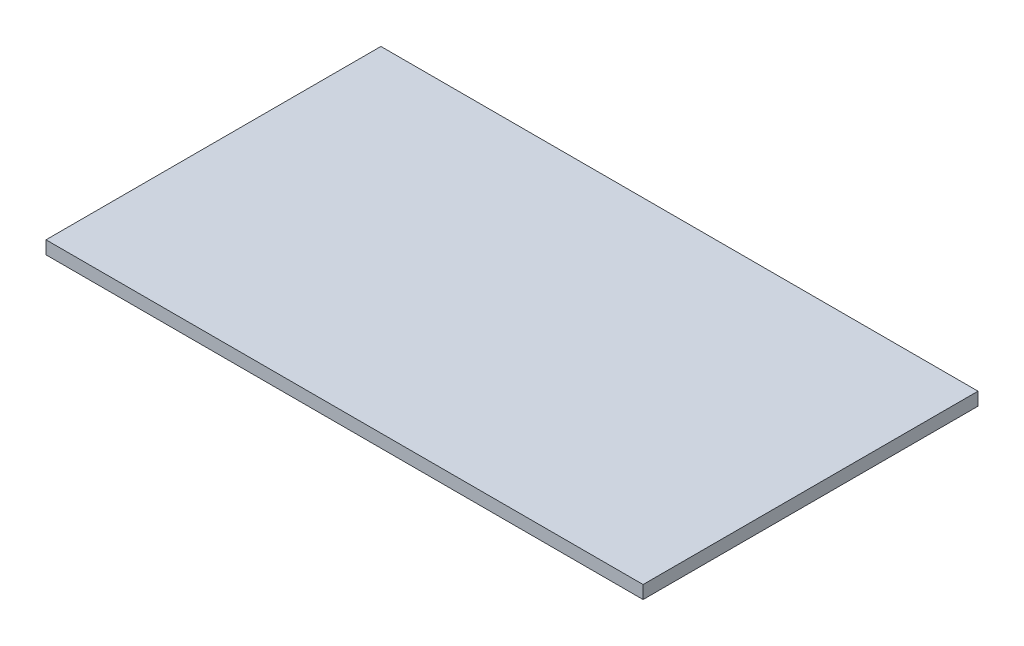
ISO-10303-21;
HEADER;
FILE_DESCRIPTION(('STEP AP214'),'2;1');
FILE_NAME('part.step','',(''),(''),'','','');
FILE_SCHEMA(('AUTOMOTIVE_DESIGN { 1 0 10303 214 1 1 1 1 }'));
ENDSEC;
DATA;
#1=APPLICATION_CONTEXT('core data for automotive mechanical design processes');
#2=APPLICATION_PROTOCOL_DEFINITION('international standard','automotive_design',2000,#1);
#3=PRODUCT_CONTEXT('',#1,'mechanical');
#4=PRODUCT('Part','Part','',(#3));
#5=PRODUCT_RELATED_PRODUCT_CATEGORY('part','',(#4));
#6=PRODUCT_DEFINITION_FORMATION('','',#4);
#7=PRODUCT_DEFINITION_CONTEXT('part definition',#1,'design');
#8=PRODUCT_DEFINITION('design','',#6,#7);
#9=PRODUCT_DEFINITION_SHAPE('','',#8);
#10=(LENGTH_UNIT() NAMED_UNIT(*) SI_UNIT(.MILLI.,.METRE.));
#11=(NAMED_UNIT(*) PLANE_ANGLE_UNIT() SI_UNIT($,.RADIAN.));
#12=(NAMED_UNIT(*) SI_UNIT($,.STERADIAN.) SOLID_ANGLE_UNIT());
#13=UNCERTAINTY_MEASURE_WITH_UNIT(LENGTH_MEASURE(1.E-05),#10,'distance_accuracy_value','');
#14=(GEOMETRIC_REPRESENTATION_CONTEXT(3) GLOBAL_UNCERTAINTY_ASSIGNED_CONTEXT((#13)) GLOBAL_UNIT_ASSIGNED_CONTEXT((#10,
#11,#12)) REPRESENTATION_CONTEXT('',''));
#15=CARTESIAN_POINT('',(0.,0.,0.));
#16=DIRECTION('',(0.,0.,1.));
#17=DIRECTION('',(1.,0.,0.));
#18=AXIS2_PLACEMENT_3D('',#15,#16,#17);
#19=CARTESIAN_POINT('',(51.,-50.,128.442125645559));
#20=DIRECTION('',(1.,0.,0.));
#21=DIRECTION('',(0.,0.,-1.));
#22=AXIS2_PLACEMENT_3D('',#19,#20,#21);
#23=PLANE('',#22);
#24=DIRECTION('',(0.,0.,-1.));
#25=VECTOR('',#24,1.);
#26=CARTESIAN_POINT('',(51.,-45.,128.442125645559));
#27=LINE('',#26,#25);
#28=CARTESIAN_POINT('',(51.,-45.,128.442125645559));
#29=VERTEX_POINT('',#28);
#30=CARTESIAN_POINT('',(51.,-45.,0.));
#31=VERTEX_POINT('',#30);
#32=EDGE_CURVE('E103',#29,#31,#27,.T.);
#33=ORIENTED_EDGE('',*,*,#32,.T.);
#34=DIRECTION('',(0.,1.,0.));
#35=VECTOR('',#34,1.);
#36=CARTESIAN_POINT('',(51.,-50.,0.));
#37=LINE('',#36,#35);
#38=CARTESIAN_POINT('',(51.,-50.,0.));
#39=VERTEX_POINT('',#38);
#40=EDGE_CURVE('E11',#39,#31,#37,.T.);
#41=ORIENTED_EDGE('',*,*,#40,.F.);
#42=DIRECTION('',(0.,0.,-1.));
#43=VECTOR('',#42,1.);
#44=CARTESIAN_POINT('',(51.,-50.,128.442125645559));
#45=LINE('',#44,#43);
#46=CARTESIAN_POINT('',(51.,-50.,128.442125645559));
#47=VERTEX_POINT('',#46);
#48=EDGE_CURVE('E91',#47,#39,#45,.T.);
#49=ORIENTED_EDGE('',*,*,#48,.F.);
#50=DIRECTION('',(0.,1.,0.));
#51=VECTOR('',#50,1.);
#52=CARTESIAN_POINT('',(51.,-50.,128.442125645559));
#53=LINE('',#52,#51);
#54=EDGE_CURVE('E99',#47,#29,#53,.T.);
#55=ORIENTED_EDGE('',*,*,#54,.T.);
#56=EDGE_LOOP('',(#33,#41,#49,#55));
#57=FACE_BOUND('',#56,.T.);
#58=ADVANCED_FACE('F40',(#57),#23,.F.);
#59=CARTESIAN_POINT('',(51.,-50.,0.));
#60=DIRECTION('',(0.,0.,1.));
#61=DIRECTION('',(1.,0.,0.));
#62=AXIS2_PLACEMENT_3D('',#59,#60,#61);
#63=PLANE('',#62);
#64=DIRECTION('',(1.,0.,0.));
#65=VECTOR('',#64,1.);
#66=CARTESIAN_POINT('',(51.,-45.,0.));
#67=LINE('',#66,#65);
#68=CARTESIAN_POINT('',(280.,-45.,0.));
#69=VERTEX_POINT('',#68);
#70=EDGE_CURVE('E95',#31,#69,#67,.T.);
#71=ORIENTED_EDGE('',*,*,#70,.T.);
#72=DIRECTION('',(0.,1.,0.));
#73=VECTOR('',#72,1.);
#74=CARTESIAN_POINT('',(280.,-50.,0.));
#75=LINE('',#74,#73);
#76=CARTESIAN_POINT('',(280.,-50.,0.));
#77=VERTEX_POINT('',#76);
#78=EDGE_CURVE('E48',#77,#69,#75,.T.);
#79=ORIENTED_EDGE('',*,*,#78,.F.);
#80=DIRECTION('',(1.,0.,0.));
#81=VECTOR('',#80,1.);
#82=CARTESIAN_POINT('',(51.,-50.,0.));
#83=LINE('',#82,#81);
#84=EDGE_CURVE('E86',#39,#77,#83,.T.);
#85=ORIENTED_EDGE('',*,*,#84,.F.);
#86=ORIENTED_EDGE('',*,*,#40,.T.);
#87=EDGE_LOOP('',(#71,#79,#85,#86));
#88=FACE_BOUND('',#87,.T.);
#89=ADVANCED_FACE('F94',(#88),#63,.F.);
#90=CARTESIAN_POINT('',(280.,-50.,128.442125645559));
#91=DIRECTION('',(-1.,0.,0.));
#92=DIRECTION('',(0.,0.,1.));
#93=AXIS2_PLACEMENT_3D('',#90,#91,#92);
#94=PLANE('',#93);
#95=DIRECTION('',(0.,0.,1.));
#96=VECTOR('',#95,1.);
#97=CARTESIAN_POINT('',(280.,-45.,128.442125645559));
#98=LINE('',#97,#96);
#99=CARTESIAN_POINT('',(280.,-45.,128.442125645559));
#100=VERTEX_POINT('',#99);
#101=EDGE_CURVE('E73',#69,#100,#98,.T.);
#102=ORIENTED_EDGE('',*,*,#101,.T.);
#103=DIRECTION('',(0.,1.,0.));
#104=VECTOR('',#103,1.);
#105=CARTESIAN_POINT('',(280.,-50.,128.442125645559));
#106=LINE('',#105,#104);
#107=CARTESIAN_POINT('',(280.,-50.,128.442125645559));
#108=VERTEX_POINT('',#107);
#109=EDGE_CURVE('E96',#108,#100,#106,.T.);
#110=ORIENTED_EDGE('',*,*,#109,.F.);
#111=DIRECTION('',(0.,0.,1.));
#112=VECTOR('',#111,1.);
#113=CARTESIAN_POINT('',(280.,-50.,128.442125645559));
#114=LINE('',#113,#112);
#115=EDGE_CURVE('E89',#77,#108,#114,.T.);
#116=ORIENTED_EDGE('',*,*,#115,.F.);
#117=ORIENTED_EDGE('',*,*,#78,.T.);
#118=EDGE_LOOP('',(#102,#110,#116,#117));
#119=FACE_BOUND('',#118,.T.);
#120=ADVANCED_FACE('F97',(#119),#94,.F.);
#121=CARTESIAN_POINT('',(51.,-50.,128.442125645559));
#122=DIRECTION('',(0.,0.,-1.));
#123=DIRECTION('',(-1.,0.,0.));
#124=AXIS2_PLACEMENT_3D('',#121,#122,#123);
#125=PLANE('',#124);
#126=DIRECTION('',(-1.,0.,0.));
#127=VECTOR('',#126,1.);
#128=CARTESIAN_POINT('',(51.,-45.,128.442125645559));
#129=LINE('',#128,#127);
#130=EDGE_CURVE('E79',#100,#29,#129,.T.);
#131=ORIENTED_EDGE('',*,*,#130,.T.);
#132=ORIENTED_EDGE('',*,*,#54,.F.);
#133=DIRECTION('',(-1.,0.,0.));
#134=VECTOR('',#133,1.);
#135=CARTESIAN_POINT('',(51.,-50.,128.442125645559));
#136=LINE('',#135,#134);
#137=EDGE_CURVE('E56',#108,#47,#136,.T.);
#138=ORIENTED_EDGE('',*,*,#137,.F.);
#139=ORIENTED_EDGE('',*,*,#109,.T.);
#140=EDGE_LOOP('',(#131,#132,#138,#139));
#141=FACE_BOUND('',#140,.T.);
#142=ADVANCED_FACE('F110',(#141),#125,.F.);
#143=CARTESIAN_POINT('',(0.,-50.,0.));
#144=DIRECTION('',(0.,-1.,0.));
#145=DIRECTION('',(0.,0.,-1.));
#146=AXIS2_PLACEMENT_3D('',#143,#144,#145);
#147=PLANE('',#146);
#148=ORIENTED_EDGE('',*,*,#48,.T.);
#149=ORIENTED_EDGE('',*,*,#84,.T.);
#150=ORIENTED_EDGE('',*,*,#115,.T.);
#151=ORIENTED_EDGE('',*,*,#137,.T.);
#152=EDGE_LOOP('',(#148,#149,#150,#151));
#153=FACE_BOUND('',#152,.T.);
#154=ADVANCED_FACE('F87',(#153),#147,.T.);
#155=CARTESIAN_POINT('',(0.,-45.,0.));
#156=DIRECTION('',(0.,-1.,0.));
#157=DIRECTION('',(0.,0.,-1.));
#158=AXIS2_PLACEMENT_3D('',#155,#156,#157);
#159=PLANE('',#158);
#160=ORIENTED_EDGE('',*,*,#32,.F.);
#161=ORIENTED_EDGE('',*,*,#130,.F.);
#162=ORIENTED_EDGE('',*,*,#101,.F.);
#163=ORIENTED_EDGE('',*,*,#70,.F.);
#164=EDGE_LOOP('',(#160,#161,#162,#163));
#165=FACE_BOUND('',#164,.T.);
#166=ADVANCED_FACE('F113',(#165),#159,.F.);
#167=CLOSED_SHELL('',(#58,#89,#120,#142,#154,#166));
#168=MANIFOLD_SOLID_BREP('B2',#167);
#169=ADVANCED_BREP_SHAPE_REPRESENTATION('',(#18,#168),#14);
#170=SHAPE_DEFINITION_REPRESENTATION(#9,#169);
ENDSEC;
END-ISO-10303-21;
